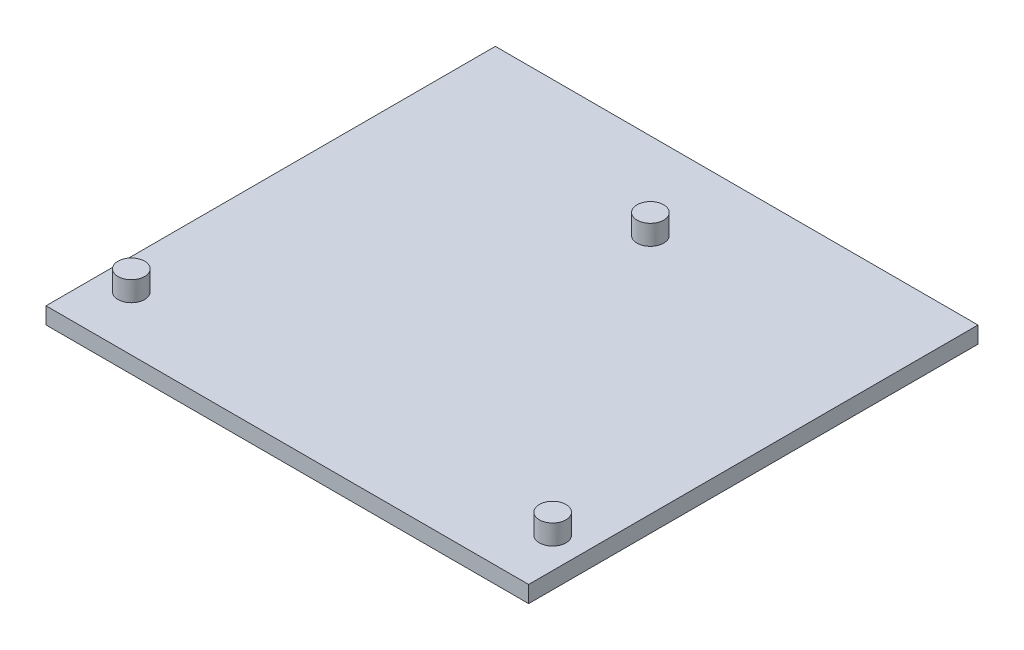
ISO-10303-21;
HEADER;
FILE_DESCRIPTION(('STEP AP214'),'2;1');
FILE_NAME('part.step','',(''),(''),'','','');
FILE_SCHEMA(('AUTOMOTIVE_DESIGN { 1 0 10303 214 1 1 1 1 }'));
ENDSEC;
DATA;
#1=APPLICATION_CONTEXT('core data for automotive mechanical design processes');
#2=APPLICATION_PROTOCOL_DEFINITION('international standard','automotive_design',2000,#1);
#3=PRODUCT_CONTEXT('',#1,'mechanical');
#4=PRODUCT('Part','Part','',(#3));
#5=PRODUCT_RELATED_PRODUCT_CATEGORY('part','',(#4));
#6=PRODUCT_DEFINITION_FORMATION('','',#4);
#7=PRODUCT_DEFINITION_CONTEXT('part definition',#1,'design');
#8=PRODUCT_DEFINITION('design','',#6,#7);
#9=PRODUCT_DEFINITION_SHAPE('','',#8);
#10=(LENGTH_UNIT() NAMED_UNIT(*) SI_UNIT(.MILLI.,.METRE.));
#11=(NAMED_UNIT(*) PLANE_ANGLE_UNIT() SI_UNIT($,.RADIAN.));
#12=(NAMED_UNIT(*) SI_UNIT($,.STERADIAN.) SOLID_ANGLE_UNIT());
#13=UNCERTAINTY_MEASURE_WITH_UNIT(LENGTH_MEASURE(1.E-05),#10,'distance_accuracy_value','');
#14=(GEOMETRIC_REPRESENTATION_CONTEXT(3) GLOBAL_UNCERTAINTY_ASSIGNED_CONTEXT((#13)) GLOBAL_UNIT_ASSIGNED_CONTEXT((#10,
#11,#12)) REPRESENTATION_CONTEXT('',''));
#15=CARTESIAN_POINT('',(0.,0.,0.));
#16=DIRECTION('',(0.,0.,1.));
#17=DIRECTION('',(1.,0.,0.));
#18=AXIS2_PLACEMENT_3D('',#15,#16,#17);
#19=CARTESIAN_POINT('',(14.5,1.,13.5));
#20=DIRECTION('',(-1.,0.,0.));
#21=DIRECTION('',(0.,0.,1.));
#22=AXIS2_PLACEMENT_3D('',#19,#20,#21);
#23=PLANE('',#22);
#24=DIRECTION('',(0.,0.,-1.));
#25=VECTOR('',#24,1.);
#26=CARTESIAN_POINT('',(14.5,0.,13.5));
#27=LINE('',#26,#25);
#28=CARTESIAN_POINT('',(14.5,0.,13.5));
#29=VERTEX_POINT('',#28);
#30=CARTESIAN_POINT('',(14.5,0.,-13.5));
#31=VERTEX_POINT('',#30);
#32=EDGE_CURVE('E100',#29,#31,#27,.T.);
#33=ORIENTED_EDGE('',*,*,#32,.T.);
#34=DIRECTION('',(0.,-1.,0.));
#35=VECTOR('',#34,1.);
#36=CARTESIAN_POINT('',(14.5,1.,-13.5));
#37=LINE('',#36,#35);
#38=CARTESIAN_POINT('',(14.5,1.,-13.5));
#39=VERTEX_POINT('',#38);
#40=EDGE_CURVE('E91',#39,#31,#37,.T.);
#41=ORIENTED_EDGE('',*,*,#40,.F.);
#42=DIRECTION('',(0.,0.,-1.));
#43=VECTOR('',#42,1.);
#44=CARTESIAN_POINT('',(14.5,1.,13.5));
#45=LINE('',#44,#43);
#46=CARTESIAN_POINT('',(14.5,1.,13.5));
#47=VERTEX_POINT('',#46);
#48=EDGE_CURVE('E85',#47,#39,#45,.T.);
#49=ORIENTED_EDGE('',*,*,#48,.F.);
#50=DIRECTION('',(0.,-1.,0.));
#51=VECTOR('',#50,1.);
#52=CARTESIAN_POINT('',(14.5,1.,13.5));
#53=LINE('',#52,#51);
#54=EDGE_CURVE('E96',#47,#29,#53,.T.);
#55=ORIENTED_EDGE('',*,*,#54,.T.);
#56=EDGE_LOOP('',(#33,#41,#49,#55));
#57=FACE_BOUND('',#56,.T.);
#58=ADVANCED_FACE('F33',(#57),#23,.F.);
#59=CARTESIAN_POINT('',(-14.5,1.,-13.5));
#60=DIRECTION('',(0.,0.,1.));
#61=DIRECTION('',(1.,0.,0.));
#62=AXIS2_PLACEMENT_3D('',#59,#60,#61);
#63=PLANE('',#62);
#64=DIRECTION('',(-1.,0.,0.));
#65=VECTOR('',#64,1.);
#66=CARTESIAN_POINT('',(-14.5,0.,-13.5));
#67=LINE('',#66,#65);
#68=CARTESIAN_POINT('',(-14.5,0.,-13.5));
#69=VERTEX_POINT('',#68);
#70=EDGE_CURVE('E90',#31,#69,#67,.T.);
#71=ORIENTED_EDGE('',*,*,#70,.T.);
#72=DIRECTION('',(0.,-1.,0.));
#73=VECTOR('',#72,1.);
#74=CARTESIAN_POINT('',(-14.5,1.,-13.5));
#75=LINE('',#74,#73);
#76=CARTESIAN_POINT('',(-14.5,1.,-13.5));
#77=VERTEX_POINT('',#76);
#78=EDGE_CURVE('E88',#77,#69,#75,.T.);
#79=ORIENTED_EDGE('',*,*,#78,.F.);
#80=DIRECTION('',(-1.,0.,0.));
#81=VECTOR('',#80,1.);
#82=CARTESIAN_POINT('',(-14.5,1.,-13.5));
#83=LINE('',#82,#81);
#84=EDGE_CURVE('E80',#39,#77,#83,.T.);
#85=ORIENTED_EDGE('',*,*,#84,.F.);
#86=ORIENTED_EDGE('',*,*,#40,.T.);
#87=EDGE_LOOP('',(#71,#79,#85,#86));
#88=FACE_BOUND('',#87,.T.);
#89=ADVANCED_FACE('F89',(#88),#63,.F.);
#90=CARTESIAN_POINT('',(-14.5,1.,13.5));
#91=DIRECTION('',(1.,0.,0.));
#92=DIRECTION('',(0.,0.,-1.));
#93=AXIS2_PLACEMENT_3D('',#90,#91,#92);
#94=PLANE('',#93);
#95=DIRECTION('',(0.,0.,1.));
#96=VECTOR('',#95,1.);
#97=CARTESIAN_POINT('',(-14.5,0.,13.5));
#98=LINE('',#97,#96);
#99=CARTESIAN_POINT('',(-14.5,0.,13.5));
#100=VERTEX_POINT('',#99);
#101=EDGE_CURVE('E66',#69,#100,#98,.T.);
#102=ORIENTED_EDGE('',*,*,#101,.T.);
#103=DIRECTION('',(0.,-1.,0.));
#104=VECTOR('',#103,1.);
#105=CARTESIAN_POINT('',(-14.5,1.,13.5));
#106=LINE('',#105,#104);
#107=CARTESIAN_POINT('',(-14.5,1.,13.5));
#108=VERTEX_POINT('',#107);
#109=EDGE_CURVE('E92',#108,#100,#106,.T.);
#110=ORIENTED_EDGE('',*,*,#109,.F.);
#111=DIRECTION('',(0.,0.,1.));
#112=VECTOR('',#111,1.);
#113=CARTESIAN_POINT('',(-14.5,1.,13.5));
#114=LINE('',#113,#112);
#115=EDGE_CURVE('E83',#77,#108,#114,.T.);
#116=ORIENTED_EDGE('',*,*,#115,.F.);
#117=ORIENTED_EDGE('',*,*,#78,.T.);
#118=EDGE_LOOP('',(#102,#110,#116,#117));
#119=FACE_BOUND('',#118,.T.);
#120=ADVANCED_FACE('F94',(#119),#94,.F.);
#121=CARTESIAN_POINT('',(-14.5,1.,13.5));
#122=DIRECTION('',(0.,0.,-1.));
#123=DIRECTION('',(-1.,0.,0.));
#124=AXIS2_PLACEMENT_3D('',#121,#122,#123);
#125=PLANE('',#124);
#126=DIRECTION('',(1.,0.,0.));
#127=VECTOR('',#126,1.);
#128=CARTESIAN_POINT('',(-14.5,0.,13.5));
#129=LINE('',#128,#127);
#130=EDGE_CURVE('E72',#100,#29,#129,.T.);
#131=ORIENTED_EDGE('',*,*,#130,.T.);
#132=ORIENTED_EDGE('',*,*,#54,.F.);
#133=DIRECTION('',(1.,0.,0.));
#134=VECTOR('',#133,1.);
#135=CARTESIAN_POINT('',(-14.5,1.,13.5));
#136=LINE('',#135,#134);
#137=EDGE_CURVE('E49',#108,#47,#136,.T.);
#138=ORIENTED_EDGE('',*,*,#137,.F.);
#139=ORIENTED_EDGE('',*,*,#109,.T.);
#140=EDGE_LOOP('',(#131,#132,#138,#139));
#141=FACE_BOUND('',#140,.T.);
#142=ADVANCED_FACE('F120',(#141),#125,.F.);
#143=CARTESIAN_POINT('',(0.,1.,0.));
#144=DIRECTION('',(0.,-1.,0.));
#145=DIRECTION('',(0.,0.,-1.));
#146=AXIS2_PLACEMENT_3D('',#143,#144,#145);
#147=PLANE('',#146);
#148=CARTESIAN_POINT('',(12.66,1.,10.2151846560332));
#149=DIRECTION('',(0.,-1.,0.));
#150=DIRECTION('',(0.,0.,-1.));
#151=AXIS2_PLACEMENT_3D('',#148,#149,#150);
#152=CIRCLE('',#151,0.800000000000001);
#153=CARTESIAN_POINT('',(12.66,1.,9.41518465603322));
#154=VERTEX_POINT('',#153);
#155=EDGE_CURVE('E11',#154,#154,#152,.F.);
#156=ORIENTED_EDGE('',*,*,#155,.F.);
#157=EDGE_LOOP('',(#156));
#158=FACE_BOUND('',#157,.T.);
#159=CARTESIAN_POINT('',(-12.66,1.,10.2151846560332));
#160=DIRECTION('',(0.,-1.,0.));
#161=DIRECTION('',(0.,0.,-1.));
#162=AXIS2_PLACEMENT_3D('',#159,#160,#161);
#163=CIRCLE('',#162,0.800000000000001);
#164=CARTESIAN_POINT('',(-12.66,1.,9.41518465603322));
#165=VERTEX_POINT('',#164);
#166=EDGE_CURVE('E41',#165,#165,#163,.F.);
#167=ORIENTED_EDGE('',*,*,#166,.F.);
#168=EDGE_LOOP('',(#167));
#169=FACE_BOUND('',#168,.T.);
#170=CARTESIAN_POINT('',(0.,1.,-8.31481534396679));
#171=DIRECTION('',(0.,-1.,0.));
#172=DIRECTION('',(0.,0.,-1.));
#173=AXIS2_PLACEMENT_3D('',#170,#171,#172);
#174=CIRCLE('',#173,0.8);
#175=CARTESIAN_POINT('',(0.,1.,-9.11481534396679));
#176=VERTEX_POINT('',#175);
#177=EDGE_CURVE('E110',#176,#176,#174,.F.);
#178=ORIENTED_EDGE('',*,*,#177,.F.);
#179=EDGE_LOOP('',(#178));
#180=FACE_BOUND('',#179,.T.);
#181=ORIENTED_EDGE('',*,*,#48,.T.);
#182=ORIENTED_EDGE('',*,*,#84,.T.);
#183=ORIENTED_EDGE('',*,*,#115,.T.);
#184=ORIENTED_EDGE('',*,*,#137,.T.);
#185=EDGE_LOOP('',(#181,#182,#183,#184));
#186=FACE_BOUND('',#185,.T.);
#187=ADVANCED_FACE('F81',(#158,#169,#180,#186),#147,.F.);
#188=CARTESIAN_POINT('',(0.,0.,0.));
#189=DIRECTION('',(0.,-1.,0.));
#190=DIRECTION('',(0.,0.,-1.));
#191=AXIS2_PLACEMENT_3D('',#188,#189,#190);
#192=PLANE('',#191);
#193=ORIENTED_EDGE('',*,*,#32,.F.);
#194=ORIENTED_EDGE('',*,*,#130,.F.);
#195=ORIENTED_EDGE('',*,*,#101,.F.);
#196=ORIENTED_EDGE('',*,*,#70,.F.);
#197=EDGE_LOOP('',(#193,#194,#195,#196));
#198=FACE_BOUND('',#197,.T.);
#199=ADVANCED_FACE('F119',(#198),#192,.T.);
#200=CARTESIAN_POINT('',(0.,2.2,-8.31481534396679));
#201=DIRECTION('',(0.,-1.,0.));
#202=DIRECTION('',(0.,0.,-1.));
#203=AXIS2_PLACEMENT_3D('',#200,#201,#202);
#204=CYLINDRICAL_SURFACE('',#203,0.8);
#205=CARTESIAN_POINT('',(0.,2.2,-8.31481534396679));
#206=DIRECTION('',(0.,1.,0.));
#207=DIRECTION('',(0.,0.,1.));
#208=AXIS2_PLACEMENT_3D('',#205,#206,#207);
#209=CIRCLE('',#208,0.8);
#210=CARTESIAN_POINT('',(0.,2.2,-7.51481534396679));
#211=VERTEX_POINT('',#210);
#212=EDGE_CURVE('E103',#211,#211,#209,.T.);
#213=ORIENTED_EDGE('',*,*,#212,.F.);
#214=EDGE_LOOP('',(#213));
#215=FACE_BOUND('',#214,.T.);
#216=ORIENTED_EDGE('',*,*,#177,.T.);
#217=EDGE_LOOP('',(#216));
#218=FACE_BOUND('',#217,.T.);
#219=ADVANCED_FACE('F125',(#215,#218),#204,.T.);
#220=CARTESIAN_POINT('',(0.,2.2,-8.31481534396679));
#221=DIRECTION('',(0.,1.,0.));
#222=DIRECTION('',(0.,0.,1.));
#223=AXIS2_PLACEMENT_3D('',#220,#221,#222);
#224=PLANE('',#223);
#225=ORIENTED_EDGE('',*,*,#212,.T.);
#226=EDGE_LOOP('',(#225));
#227=FACE_BOUND('',#226,.T.);
#228=ADVANCED_FACE('F127',(#227),#224,.T.);
#229=CARTESIAN_POINT('',(-12.66,2.2,10.2151846560332));
#230=DIRECTION('',(0.,-1.,0.));
#231=DIRECTION('',(0.,0.,-1.));
#232=AXIS2_PLACEMENT_3D('',#229,#230,#231);
#233=CYLINDRICAL_SURFACE('',#232,0.800000000000001);
#234=CARTESIAN_POINT('',(-12.66,2.2,10.2151846560332));
#235=DIRECTION('',(0.,1.,0.));
#236=DIRECTION('',(0.,0.,1.));
#237=AXIS2_PLACEMENT_3D('',#234,#235,#236);
#238=CIRCLE('',#237,0.800000000000001);
#239=CARTESIAN_POINT('',(-12.66,2.2,11.0151846560332));
#240=VERTEX_POINT('',#239);
#241=EDGE_CURVE('E233',#240,#240,#238,.T.);
#242=ORIENTED_EDGE('',*,*,#241,.F.);
#243=EDGE_LOOP('',(#242));
#244=FACE_BOUND('',#243,.T.);
#245=ORIENTED_EDGE('',*,*,#166,.T.);
#246=EDGE_LOOP('',(#245));
#247=FACE_BOUND('',#246,.T.);
#248=ADVANCED_FACE('F115',(#244,#247),#233,.T.);
#249=CARTESIAN_POINT('',(-12.66,2.2,10.2151846560332));
#250=DIRECTION('',(0.,1.,0.));
#251=DIRECTION('',(0.,0.,1.));
#252=AXIS2_PLACEMENT_3D('',#249,#250,#251);
#253=PLANE('',#252);
#254=ORIENTED_EDGE('',*,*,#241,.T.);
#255=EDGE_LOOP('',(#254));
#256=FACE_BOUND('',#255,.T.);
#257=ADVANCED_FACE('F196',(#256),#253,.T.);
#258=CARTESIAN_POINT('',(12.66,2.2,10.2151846560332));
#259=DIRECTION('',(0.,-1.,0.));
#260=DIRECTION('',(0.,0.,-1.));
#261=AXIS2_PLACEMENT_3D('',#258,#259,#260);
#262=CYLINDRICAL_SURFACE('',#261,0.800000000000001);
#263=CARTESIAN_POINT('',(12.66,2.2,10.2151846560332));
#264=DIRECTION('',(0.,1.,0.));
#265=DIRECTION('',(0.,0.,1.));
#266=AXIS2_PLACEMENT_3D('',#263,#264,#265);
#267=CIRCLE('',#266,0.800000000000001);
#268=CARTESIAN_POINT('',(12.66,2.2,11.0151846560332));
#269=VERTEX_POINT('',#268);
#270=EDGE_CURVE('E232',#269,#269,#267,.T.);
#271=ORIENTED_EDGE('',*,*,#270,.F.);
#272=EDGE_LOOP('',(#271));
#273=FACE_BOUND('',#272,.T.);
#274=ORIENTED_EDGE('',*,*,#155,.T.);
#275=EDGE_LOOP('',(#274));
#276=FACE_BOUND('',#275,.T.);
#277=ADVANCED_FACE('F205',(#273,#276),#262,.T.);
#278=CARTESIAN_POINT('',(12.66,2.2,10.2151846560332));
#279=DIRECTION('',(0.,1.,0.));
#280=DIRECTION('',(0.,0.,1.));
#281=AXIS2_PLACEMENT_3D('',#278,#279,#280);
#282=PLANE('',#281);
#283=ORIENTED_EDGE('',*,*,#270,.T.);
#284=EDGE_LOOP('',(#283));
#285=FACE_BOUND('',#284,.T.);
#286=ADVANCED_FACE('F214',(#285),#282,.T.);
#287=CLOSED_SHELL('',(#58,#89,#120,#142,#187,#199,#219,#228,#248,#257,#277,#286));
#288=MANIFOLD_SOLID_BREP('B2',#287);
#289=ADVANCED_BREP_SHAPE_REPRESENTATION('',(#18,#288),#14);
#290=SHAPE_DEFINITION_REPRESENTATION(#9,#289);
ENDSEC;
END-ISO-10303-21;
